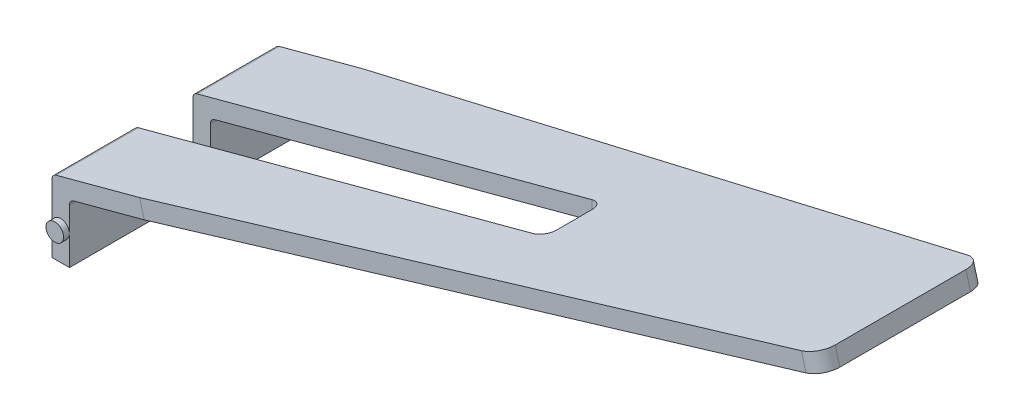
ISO-10303-21;
HEADER;
FILE_DESCRIPTION(('STEP AP214'),'2;1');
FILE_NAME('part.step','',(''),(''),'','','');
FILE_SCHEMA(('AUTOMOTIVE_DESIGN { 1 0 10303 214 1 1 1 1 }'));
ENDSEC;
DATA;
#1=APPLICATION_CONTEXT('core data for automotive mechanical design processes');
#2=APPLICATION_PROTOCOL_DEFINITION('international standard','automotive_design',2000,#1);
#3=PRODUCT_CONTEXT('',#1,'mechanical');
#4=PRODUCT('Part','Part','',(#3));
#5=PRODUCT_RELATED_PRODUCT_CATEGORY('part','',(#4));
#6=PRODUCT_DEFINITION_FORMATION('','',#4);
#7=PRODUCT_DEFINITION_CONTEXT('part definition',#1,'design');
#8=PRODUCT_DEFINITION('design','',#6,#7);
#9=PRODUCT_DEFINITION_SHAPE('','',#8);
#10=(LENGTH_UNIT() NAMED_UNIT(*) SI_UNIT(.MILLI.,.METRE.));
#11=(NAMED_UNIT(*) PLANE_ANGLE_UNIT() SI_UNIT($,.RADIAN.));
#12=(NAMED_UNIT(*) SI_UNIT($,.STERADIAN.) SOLID_ANGLE_UNIT());
#13=UNCERTAINTY_MEASURE_WITH_UNIT(LENGTH_MEASURE(1.E-05),#10,'distance_accuracy_value','');
#14=(GEOMETRIC_REPRESENTATION_CONTEXT(3) GLOBAL_UNCERTAINTY_ASSIGNED_CONTEXT((#13)) GLOBAL_UNIT_ASSIGNED_CONTEXT((#10,
#11,#12)) REPRESENTATION_CONTEXT('',''));
#15=CARTESIAN_POINT('',(0.,0.,0.));
#16=DIRECTION('',(0.,0.,1.));
#17=DIRECTION('',(1.,0.,0.));
#18=AXIS2_PLACEMENT_3D('',#15,#16,#17);
#19=CARTESIAN_POINT('',(0.3,0.,3.8));
#20=DIRECTION('',(0.,1.,0.));
#21=DIRECTION('',(0.,0.,1.));
#22=AXIS2_PLACEMENT_3D('',#19,#20,#21);
#23=PLANE('',#22);
#24=DIRECTION('',(0.,0.,-1.));
#25=VECTOR('',#24,1.);
#26=CARTESIAN_POINT('',(0.,0.,3.8));
#27=LINE('',#26,#25);
#28=CARTESIAN_POINT('',(0.,0.,3.8));
#29=VERTEX_POINT('',#28);
#30=CARTESIAN_POINT('',(0.,0.,2.40000000000001));
#31=VERTEX_POINT('',#30);
#32=EDGE_CURVE('E231',#29,#31,#27,.T.);
#33=ORIENTED_EDGE('',*,*,#32,.T.);
#34=DIRECTION('',(-1.,0.,0.));
#35=VECTOR('',#34,1.);
#36=CARTESIAN_POINT('',(0.,0.,2.40000000000001));
#37=LINE('',#36,#35);
#38=CARTESIAN_POINT('',(0.3,0.,2.40000000000001));
#39=VERTEX_POINT('',#38);
#40=EDGE_CURVE('E225',#39,#31,#37,.T.);
#41=ORIENTED_EDGE('',*,*,#40,.F.);
#42=DIRECTION('',(0.,0.,-1.));
#43=VECTOR('',#42,1.);
#44=CARTESIAN_POINT('',(0.3,0.,3.8));
#45=LINE('',#44,#43);
#46=CARTESIAN_POINT('',(0.3,0.,3.8));
#47=VERTEX_POINT('',#46);
#48=EDGE_CURVE('E247',#47,#39,#45,.T.);
#49=ORIENTED_EDGE('',*,*,#48,.F.);
#50=DIRECTION('',(1.,0.,0.));
#51=VECTOR('',#50,1.);
#52=CARTESIAN_POINT('',(0.3,0.,3.8));
#53=LINE('',#52,#51);
#54=EDGE_CURVE('E380',#29,#47,#53,.T.);
#55=ORIENTED_EDGE('',*,*,#54,.F.);
#56=EDGE_LOOP('',(#33,#41,#49,#55));
#57=FACE_BOUND('',#56,.T.);
#58=ADVANCED_FACE('F45',(#57),#23,.F.);
#59=CARTESIAN_POINT('',(0.3,1.,3.8));
#60=DIRECTION('',(-1.,0.,0.));
#61=DIRECTION('',(0.,-1.,0.));
#62=AXIS2_PLACEMENT_3D('',#59,#60,#61);
#63=PLANE('',#62);
#64=DIRECTION('',(0.,1.,0.));
#65=VECTOR('',#64,1.);
#66=CARTESIAN_POINT('',(0.3,1.,2.40000000000001));
#67=LINE('',#66,#65);
#68=CARTESIAN_POINT('',(0.3,0.923267301202103,2.40000000000001));
#69=VERTEX_POINT('',#68);
#70=EDGE_CURVE('E365',#39,#69,#67,.T.);
#71=ORIENTED_EDGE('',*,*,#70,.T.);
#72=DIRECTION('',(0.,0.,-1.));
#73=VECTOR('',#72,1.);
#74=CARTESIAN_POINT('',(0.3,0.923267301202103,3.8));
#75=LINE('',#74,#73);
#76=CARTESIAN_POINT('',(0.3,0.923267301202103,3.8));
#77=VERTEX_POINT('',#76);
#78=EDGE_CURVE('E298',#69,#77,#75,.F.);
#79=ORIENTED_EDGE('',*,*,#78,.T.);
#80=DIRECTION('',(0.,1.,0.));
#81=VECTOR('',#80,1.);
#82=CARTESIAN_POINT('',(0.3,1.,3.8));
#83=LINE('',#82,#81);
#84=CARTESIAN_POINT('',(0.3,0.5,3.8));
#85=VERTEX_POINT('',#84);
#86=EDGE_CURVE('E383',#85,#77,#83,.T.);
#87=ORIENTED_EDGE('',*,*,#86,.F.);
#88=EDGE_CURVE('E384',#47,#85,#83,.T.);
#89=ORIENTED_EDGE('',*,*,#88,.F.);
#90=ORIENTED_EDGE('',*,*,#48,.T.);
#91=EDGE_LOOP('',(#71,#79,#87,#89,#90));
#92=FACE_BOUND('',#91,.T.);
#93=ADVANCED_FACE('F435',(#92),#63,.F.);
#94=CARTESIAN_POINT('',(0.,0.,3.8));
#95=DIRECTION('',(1.,0.,0.));
#96=DIRECTION('',(0.,0.,-1.));
#97=AXIS2_PLACEMENT_3D('',#94,#95,#96);
#98=PLANE('',#97);
#99=DIRECTION('',(0.,-1.,0.));
#100=VECTOR('',#99,1.);
#101=CARTESIAN_POINT('',(0.,0.,3.8));
#102=LINE('',#101,#100);
#103=CARTESIAN_POINT('',(0.,1.15346539759579,3.8));
#104=VERTEX_POINT('',#103);
#105=CARTESIAN_POINT('',(0.,0.5,3.8));
#106=VERTEX_POINT('',#105);
#107=EDGE_CURVE('E232',#104,#106,#102,.T.);
#108=ORIENTED_EDGE('',*,*,#107,.F.);
#109=DIRECTION('',(0.,0.,-1.));
#110=VECTOR('',#109,1.);
#111=CARTESIAN_POINT('',(0.,1.15346539759579,3.8));
#112=LINE('',#111,#110);
#113=CARTESIAN_POINT('',(0.,1.15346539759579,2.40000000000001));
#114=VERTEX_POINT('',#113);
#115=EDGE_CURVE('E282',#104,#114,#112,.T.);
#116=ORIENTED_EDGE('',*,*,#115,.T.);
#117=DIRECTION('',(0.,-1.,0.));
#118=VECTOR('',#117,1.);
#119=CARTESIAN_POINT('',(0.,0.,2.40000000000001));
#120=LINE('',#119,#118);
#121=EDGE_CURVE('E216',#114,#31,#120,.T.);
#122=ORIENTED_EDGE('',*,*,#121,.T.);
#123=ORIENTED_EDGE('',*,*,#32,.F.);
#124=EDGE_CURVE('E236',#106,#29,#102,.T.);
#125=ORIENTED_EDGE('',*,*,#124,.F.);
#126=EDGE_LOOP('',(#108,#116,#122,#123,#125));
#127=FACE_BOUND('',#126,.T.);
#128=ADVANCED_FACE('F443',(#127),#98,.F.);
#129=CARTESIAN_POINT('',(0.,0.,3.8));
#130=DIRECTION('',(0.,0.,-1.));
#131=DIRECTION('',(-1.,0.,0.));
#132=AXIS2_PLACEMENT_3D('',#129,#130,#131);
#133=PLANE('',#132);
#134=DIRECTION('',(-0.965925826289069,-0.258819045102518,0.));
#135=VECTOR('',#134,1.);
#136=CARTESIAN_POINT('',(0.,1.23019809639369,3.8));
#137=LINE('',#136,#135);
#138=CARTESIAN_POINT('',(1.49536641050825,1.630880318478,3.8));
#139=VERTEX_POINT('',#138);
#140=CARTESIAN_POINT('',(0.0741180954897482,1.2500579802247,3.8));
#141=VERTEX_POINT('',#140);
#142=EDGE_CURVE('E390',#139,#141,#137,.T.);
#143=ORIENTED_EDGE('',*,*,#142,.T.);
#144=CARTESIAN_POINT('',(0.1,1.15346539759579,3.8));
#145=DIRECTION('',(0.,0.,-1.));
#146=DIRECTION('',(-1.,0.,0.));
#147=AXIS2_PLACEMENT_3D('',#144,#145,#146);
#148=CIRCLE('',#147,0.1);
#149=EDGE_CURVE('E288',#141,#104,#148,.F.);
#150=ORIENTED_EDGE('',*,*,#149,.T.);
#151=ORIENTED_EDGE('',*,*,#107,.T.);
#152=CARTESIAN_POINT('',(0.15,0.5,3.8));
#153=DIRECTION('',(0.,0.,-1.));
#154=DIRECTION('',(-1.,0.,0.));
#155=AXIS2_PLACEMENT_3D('',#152,#153,#154);
#156=CIRCLE('',#155,0.15);
#157=EDGE_CURVE('E379',#106,#85,#156,.T.);
#158=ORIENTED_EDGE('',*,*,#157,.T.);
#159=ORIENTED_EDGE('',*,*,#86,.T.);
#160=CARTESIAN_POINT('',(0.399999999999999,0.923267301202103,3.8));
#161=DIRECTION('',(0.,0.,-1.));
#162=DIRECTION('',(-1.,0.,0.));
#163=AXIS2_PLACEMENT_3D('',#160,#161,#162);
#164=CIRCLE('',#163,0.1);
#165=CARTESIAN_POINT('',(0.374118095489749,1.01985988383101,3.8));
#166=VERTEX_POINT('',#165);
#167=EDGE_CURVE('E307',#77,#166,#164,.T.);
#168=ORIENTED_EDGE('',*,*,#167,.T.);
#169=DIRECTION('',(0.965925826289069,0.258819045102518,0.));
#170=VECTOR('',#169,1.);
#171=CARTESIAN_POINT('',(12.6346814552887,4.3050679348397,3.8));
#172=LINE('',#171,#170);
#173=CARTESIAN_POINT('',(1.57301212403901,1.34110257059128,3.8));
#174=VERTEX_POINT('',#173);
#175=EDGE_CURVE('E387',#166,#174,#172,.T.);
#176=ORIENTED_EDGE('',*,*,#175,.T.);
#177=DIRECTION('',(-0.258819045102518,0.965925826289069,0.));
#178=VECTOR('',#177,1.);
#179=CARTESIAN_POINT('',(1.80291593460667,0.483089868699056,3.8));
#180=LINE('',#179,#178);
#181=EDGE_CURVE('E250',#174,#139,#180,.T.);
#182=ORIENTED_EDGE('',*,*,#181,.T.);
#183=EDGE_LOOP('',(#143,#150,#151,#158,#159,#168,#176,#182));
#184=FACE_BOUND('',#183,.T.);
#185=ADVANCED_FACE('F453',(#184),#133,.F.);
#186=CARTESIAN_POINT('',(0.,0.,0.));
#187=DIRECTION('',(0.,0.,-1.));
#188=DIRECTION('',(-1.,0.,0.));
#189=AXIS2_PLACEMENT_3D('',#186,#187,#188);
#190=PLANE('',#189);
#191=DIRECTION('',(0.,-1.,0.));
#192=VECTOR('',#191,1.);
#193=CARTESIAN_POINT('',(0.,0.,0.));
#194=LINE('',#193,#192);
#195=CARTESIAN_POINT('',(0.,1.15346539759579,0.));
#196=VERTEX_POINT('',#195);
#197=CARTESIAN_POINT('',(0.,0.5,0.));
#198=VERTEX_POINT('',#197);
#199=EDGE_CURVE('E240',#196,#198,#194,.T.);
#200=ORIENTED_EDGE('',*,*,#199,.F.);
#201=CARTESIAN_POINT('',(0.1,1.15346539759579,0.));
#202=DIRECTION('',(0.,0.,-1.));
#203=DIRECTION('',(-1.,0.,0.));
#204=AXIS2_PLACEMENT_3D('',#201,#202,#203);
#205=CIRCLE('',#204,0.1);
#206=CARTESIAN_POINT('',(0.0741180954897482,1.2500579802247,0.));
#207=VERTEX_POINT('',#206);
#208=EDGE_CURVE('E275',#196,#207,#205,.T.);
#209=ORIENTED_EDGE('',*,*,#208,.T.);
#210=DIRECTION('',(-0.965925826289069,-0.258819045102518,0.));
#211=VECTOR('',#210,1.);
#212=CARTESIAN_POINT('',(0.,1.23019809639369,0.));
#213=LINE('',#212,#211);
#214=CARTESIAN_POINT('',(1.49536641050825,1.630880318478,0.));
#215=VERTEX_POINT('',#214);
#216=EDGE_CURVE('E400',#215,#207,#213,.T.);
#217=ORIENTED_EDGE('',*,*,#216,.F.);
#218=DIRECTION('',(0.258819045102518,-0.965925826289069,0.));
#219=VECTOR('',#218,1.);
#220=CARTESIAN_POINT('',(1.57301212403901,1.34110257059127,0.));
#221=LINE('',#220,#219);
#222=CARTESIAN_POINT('',(1.57301212403901,1.34110257059128,0.));
#223=VERTEX_POINT('',#222);
#224=EDGE_CURVE('E263',#215,#223,#221,.T.);
#225=ORIENTED_EDGE('',*,*,#224,.T.);
#226=DIRECTION('',(0.965925826289069,0.258819045102518,0.));
#227=VECTOR('',#226,1.);
#228=CARTESIAN_POINT('',(12.6346814552887,4.3050679348397,0.));
#229=LINE('',#228,#227);
#230=CARTESIAN_POINT('',(0.374118095489749,1.01985988383101,0.));
#231=VERTEX_POINT('',#230);
#232=EDGE_CURVE('E399',#231,#223,#229,.T.);
#233=ORIENTED_EDGE('',*,*,#232,.F.);
#234=CARTESIAN_POINT('',(0.399999999999999,0.923267301202103,0.));
#235=DIRECTION('',(0.,0.,-1.));
#236=DIRECTION('',(-1.,0.,0.));
#237=AXIS2_PLACEMENT_3D('',#234,#235,#236);
#238=CIRCLE('',#237,0.1);
#239=CARTESIAN_POINT('',(0.3,0.923267301202103,0.));
#240=VERTEX_POINT('',#239);
#241=EDGE_CURVE('E300',#231,#240,#238,.F.);
#242=ORIENTED_EDGE('',*,*,#241,.T.);
#243=DIRECTION('',(0.,1.,0.));
#244=VECTOR('',#243,1.);
#245=CARTESIAN_POINT('',(0.3,1.,0.));
#246=LINE('',#245,#244);
#247=CARTESIAN_POINT('',(0.3,0.5,0.));
#248=VERTEX_POINT('',#247);
#249=EDGE_CURVE('E395',#248,#240,#246,.T.);
#250=ORIENTED_EDGE('',*,*,#249,.F.);
#251=CARTESIAN_POINT('',(0.15,0.5,0.));
#252=DIRECTION('',(0.,0.,-1.));
#253=DIRECTION('',(-1.,0.,0.));
#254=AXIS2_PLACEMENT_3D('',#251,#252,#253);
#255=CIRCLE('',#254,0.15);
#256=EDGE_CURVE('E217',#198,#248,#255,.T.);
#257=ORIENTED_EDGE('',*,*,#256,.F.);
#258=EDGE_LOOP('',(#200,#209,#217,#225,#233,#242,#250,#257));
#259=FACE_BOUND('',#258,.T.);
#260=ADVANCED_FACE('F412',(#259),#190,.T.);
#261=CARTESIAN_POINT('',(0.3,0.,1.4));
#262=VERTEX_POINT('',#261);
#263=CARTESIAN_POINT('',(0.3,0.,0.));
#264=VERTEX_POINT('',#263);
#265=EDGE_CURVE('E224',#262,#264,#45,.T.);
#266=ORIENTED_EDGE('',*,*,#265,.F.);
#267=DIRECTION('',(1.,0.,0.));
#268=VECTOR('',#267,1.);
#269=CARTESIAN_POINT('',(0.,0.,1.4));
#270=LINE('',#269,#268);
#271=CARTESIAN_POINT('',(0.,0.,1.4));
#272=VERTEX_POINT('',#271);
#273=EDGE_CURVE('E208',#272,#262,#270,.T.);
#274=ORIENTED_EDGE('',*,*,#273,.F.);
#275=CARTESIAN_POINT('',(0.,0.,0.));
#276=VERTEX_POINT('',#275);
#277=EDGE_CURVE('E222',#272,#276,#27,.T.);
#278=ORIENTED_EDGE('',*,*,#277,.T.);
#279=DIRECTION('',(1.,0.,0.));
#280=VECTOR('',#279,1.);
#281=CARTESIAN_POINT('',(0.3,0.,0.));
#282=LINE('',#281,#280);
#283=EDGE_CURVE('E393',#276,#264,#282,.T.);
#284=ORIENTED_EDGE('',*,*,#283,.T.);
#285=EDGE_LOOP('',(#266,#274,#278,#284));
#286=FACE_BOUND('',#285,.T.);
#287=ADVANCED_FACE('F220',(#286),#23,.F.);
#288=ORIENTED_EDGE('',*,*,#249,.T.);
#289=DIRECTION('',(0.,0.,-1.));
#290=VECTOR('',#289,1.);
#291=CARTESIAN_POINT('',(0.3,0.923267301202103,1.4));
#292=LINE('',#291,#290);
#293=CARTESIAN_POINT('',(0.3,0.923267301202103,1.4));
#294=VERTEX_POINT('',#293);
#295=EDGE_CURVE('E296',#240,#294,#292,.F.);
#296=ORIENTED_EDGE('',*,*,#295,.T.);
#297=DIRECTION('',(0.,-1.,0.));
#298=VECTOR('',#297,1.);
#299=CARTESIAN_POINT('',(0.3,1.,1.4));
#300=LINE('',#299,#298);
#301=EDGE_CURVE('E355',#294,#262,#300,.T.);
#302=ORIENTED_EDGE('',*,*,#301,.T.);
#303=ORIENTED_EDGE('',*,*,#265,.T.);
#304=EDGE_CURVE('E396',#264,#248,#246,.T.);
#305=ORIENTED_EDGE('',*,*,#304,.T.);
#306=EDGE_LOOP('',(#288,#296,#302,#303,#305));
#307=FACE_BOUND('',#306,.T.);
#308=ADVANCED_FACE('F446',(#307),#63,.F.);
#309=CARTESIAN_POINT('',(12.6346814552887,4.3050679348397,3.8));
#310=DIRECTION('',(-0.258819045102518,0.965925826289069,0.));
#311=DIRECTION('',(-0.965925826289069,-0.258819045102518,0.));
#312=AXIS2_PLACEMENT_3D('',#309,#310,#311);
#313=PLANE('',#312);
#314=DIRECTION('',(0.965006478934081,0.258572706721185,0.0436193873653364));
#315=VECTOR('',#314,1.);
#316=CARTESIAN_POINT('',(12.6346814552887,4.3050679348397,0.5));
#317=LINE('',#316,#315);
#318=CARTESIAN_POINT('',(12.3575436352369,4.2308090797647,0.487473056201885));
#319=VERTEX_POINT('',#318);
#320=EDGE_CURVE('E258',#223,#319,#317,.T.);
#321=ORIENTED_EDGE('',*,*,#320,.T.);
#322=CARTESIAN_POINT('',(12.3449037074019,4.22742222130895,0.787187522676442));
#323=DIRECTION('',(-0.258819045102518,0.965925826289069,0.));
#324=DIRECTION('',(-0.965925826289069,-0.258819045102518,0.));
#325=AXIS2_PLACEMENT_3D('',#322,#323,#324);
#326=CIRCLE('',#325,0.3);
#327=CARTESIAN_POINT('',(12.6346814552887,4.3050679348397,0.787187522676443));
#328=VERTEX_POINT('',#327);
#329=EDGE_CURVE('E323',#319,#328,#326,.F.);
#330=ORIENTED_EDGE('',*,*,#329,.T.);
#331=DIRECTION('',(0.,0.,-1.));
#332=VECTOR('',#331,1.);
#333=CARTESIAN_POINT('',(12.6346814552887,4.3050679348397,3.8));
#334=LINE('',#333,#332);
#335=CARTESIAN_POINT('',(12.6346814552887,4.3050679348397,3.01281247732356));
#336=VERTEX_POINT('',#335);
#337=EDGE_CURVE('E244',#336,#328,#334,.T.);
#338=ORIENTED_EDGE('',*,*,#337,.F.);
#339=CARTESIAN_POINT('',(12.3449037074019,4.22742222130895,3.01281247732356));
#340=DIRECTION('',(-0.258819045102518,0.965925826289069,0.));
#341=DIRECTION('',(-0.965925826289069,-0.258819045102518,0.));
#342=AXIS2_PLACEMENT_3D('',#339,#340,#341);
#343=CIRCLE('',#342,0.3);
#344=CARTESIAN_POINT('',(12.3575436352369,4.2308090797647,3.31252694379812));
#345=VERTEX_POINT('',#344);
#346=EDGE_CURVE('E321',#336,#345,#343,.F.);
#347=ORIENTED_EDGE('',*,*,#346,.T.);
#348=DIRECTION('',(0.965006478934081,0.258572706721185,-0.0436193873653364));
#349=VECTOR('',#348,1.);
#350=CARTESIAN_POINT('',(1.57301212403901,1.34110257059128,3.8));
#351=LINE('',#350,#349);
#352=EDGE_CURVE('E261',#345,#174,#351,.F.);
#353=ORIENTED_EDGE('',*,*,#352,.T.);
#354=ORIENTED_EDGE('',*,*,#175,.F.);
#355=DIRECTION('',(0.,0.,-1.));
#356=VECTOR('',#355,1.);
#357=CARTESIAN_POINT('',(0.374118095489747,1.01985988383101,2.40000000000001));
#358=LINE('',#357,#356);
#359=CARTESIAN_POINT('',(0.374118095489746,1.01985988383101,2.40000000000001));
#360=VERTEX_POINT('',#359);
#361=EDGE_CURVE('E290',#166,#360,#358,.T.);
#362=ORIENTED_EDGE('',*,*,#361,.T.);
#363=DIRECTION('',(0.965925826289069,0.258819045102518,0.));
#364=VECTOR('',#363,1.);
#365=CARTESIAN_POINT('',(12.6346814552887,4.3050679348397,2.40000000000001));
#366=LINE('',#365,#364);
#367=CARTESIAN_POINT('',(6.8,2.74166975080228,2.40000000000001));
#368=VERTEX_POINT('',#367);
#369=EDGE_CURVE('E354',#360,#368,#366,.T.);
#370=ORIENTED_EDGE('',*,*,#369,.T.);
#371=CARTESIAN_POINT('',(6.8,2.74166975080228,2.20000000000001));
#372=DIRECTION('',(-0.258819045102518,0.965925826289069,0.));
#373=DIRECTION('',(0.965925826289069,0.258819045102518,0.));
#374=AXIS2_PLACEMENT_3D('',#371,#372,#373);
#375=ELLIPSE('',#374,0.207055236082016,0.2);
#376=CARTESIAN_POINT('',(7.,2.7952595892885,2.20000000000001));
#377=VERTEX_POINT('',#376);
#378=EDGE_CURVE('E336',#368,#377,#375,.T.);
#379=ORIENTED_EDGE('',*,*,#378,.T.);
#380=DIRECTION('',(0.,0.,-1.));
#381=VECTOR('',#380,1.);
#382=CARTESIAN_POINT('',(7.,2.7952595892885,3.79999999999999));
#383=LINE('',#382,#381);
#384=CARTESIAN_POINT('',(7.,2.7952595892885,1.60000000000001));
#385=VERTEX_POINT('',#384);
#386=EDGE_CURVE('E360',#377,#385,#383,.T.);
#387=ORIENTED_EDGE('',*,*,#386,.T.);
#388=CARTESIAN_POINT('',(6.8,2.74166975080228,1.60000000000001));
#389=DIRECTION('',(-0.258819045102518,0.965925826289069,0.));
#390=DIRECTION('',(0.965925826289069,0.258819045102518,0.));
#391=AXIS2_PLACEMENT_3D('',#388,#389,#390);
#392=ELLIPSE('',#391,0.207055236082016,0.2);
#393=CARTESIAN_POINT('',(6.8,2.74166975080228,1.40000000000001));
#394=VERTEX_POINT('',#393);
#395=EDGE_CURVE('E53',#385,#394,#392,.T.);
#396=ORIENTED_EDGE('',*,*,#395,.T.);
#397=DIRECTION('',(-0.965925826289069,-0.258819045102518,0.));
#398=VECTOR('',#397,1.);
#399=CARTESIAN_POINT('',(12.6346814552887,4.3050679348397,1.40000000000002));
#400=LINE('',#399,#398);
#401=CARTESIAN_POINT('',(0.374118095489746,1.01985988383101,1.4));
#402=VERTEX_POINT('',#401);
#403=EDGE_CURVE('E486',#394,#402,#400,.T.);
#404=ORIENTED_EDGE('',*,*,#403,.T.);
#405=DIRECTION('',(0.,0.,-1.));
#406=VECTOR('',#405,1.);
#407=CARTESIAN_POINT('',(0.374118095489747,1.01985988383101,0.));
#408=LINE('',#407,#406);
#409=EDGE_CURVE('E293',#402,#231,#408,.T.);
#410=ORIENTED_EDGE('',*,*,#409,.T.);
#411=ORIENTED_EDGE('',*,*,#232,.T.);
#412=EDGE_LOOP('',(#321,#330,#338,#347,#353,#354,#362,#370,#379,#387,#396,#404,#410,#411));
#413=FACE_BOUND('',#412,.T.);
#414=ADVANCED_FACE('F359',(#413),#313,.F.);
#415=CARTESIAN_POINT('',(12.5570357417579,4.59484568272643,3.8));
#416=DIRECTION('',(-0.965925826289069,-0.258819045102518,0.));
#417=DIRECTION('',(0.258819045102518,-0.965925826289069,0.));
#418=AXIS2_PLACEMENT_3D('',#415,#416,#417);
#419=PLANE('',#418);
#420=ORIENTED_EDGE('',*,*,#337,.T.);
#421=DIRECTION('',(-0.258819045102518,0.965925826289069,0.));
#422=VECTOR('',#421,1.);
#423=CARTESIAN_POINT('',(12.5570357417579,4.59484568272643,0.787187522676442));
#424=LINE('',#423,#422);
#425=CARTESIAN_POINT('',(12.5570357417579,4.59484568272643,0.787187522676443));
#426=VERTEX_POINT('',#425);
#427=EDGE_CURVE('E312',#328,#426,#424,.T.);
#428=ORIENTED_EDGE('',*,*,#427,.T.);
#429=DIRECTION('',(0.,0.,-1.));
#430=VECTOR('',#429,1.);
#431=CARTESIAN_POINT('',(12.5570357417579,4.59484568272643,3.8));
#432=LINE('',#431,#430);
#433=CARTESIAN_POINT('',(12.5570357417579,4.59484568272643,3.01281247732356));
#434=VERTEX_POINT('',#433);
#435=EDGE_CURVE('E235',#434,#426,#432,.T.);
#436=ORIENTED_EDGE('',*,*,#435,.F.);
#437=DIRECTION('',(-0.258819045102518,0.965925826289069,0.));
#438=VECTOR('',#437,1.);
#439=CARTESIAN_POINT('',(12.6346814552887,4.3050679348397,3.01281247732356));
#440=LINE('',#439,#438);
#441=EDGE_CURVE('E309',#434,#336,#440,.F.);
#442=ORIENTED_EDGE('',*,*,#441,.T.);
#443=EDGE_LOOP('',(#420,#428,#436,#442));
#444=FACE_BOUND('',#443,.T.);
#445=ADVANCED_FACE('F510',(#444),#419,.F.);
#446=CARTESIAN_POINT('',(0.,1.23019809639369,3.8));
#447=DIRECTION('',(0.258819045102518,-0.965925826289069,0.));
#448=DIRECTION('',(0.965925826289069,0.258819045102518,0.));
#449=AXIS2_PLACEMENT_3D('',#446,#447,#448);
#450=PLANE('',#449);
#451=ORIENTED_EDGE('',*,*,#435,.T.);
#452=CARTESIAN_POINT('',(12.2672579938712,4.51719996919567,0.787187522676442));
#453=DIRECTION('',(0.258819045102518,-0.965925826289069,0.));
#454=DIRECTION('',(0.965925826289069,0.258819045102518,0.));
#455=AXIS2_PLACEMENT_3D('',#452,#453,#454);
#456=CIRCLE('',#455,0.3);
#457=CARTESIAN_POINT('',(12.2798979217061,4.52058682765143,0.487473056201885));
#458=VERTEX_POINT('',#457);
#459=EDGE_CURVE('E317',#426,#458,#456,.F.);
#460=ORIENTED_EDGE('',*,*,#459,.T.);
#461=DIRECTION('',(-0.965006478934081,-0.258572706721186,-0.0436193873653365));
#462=VECTOR('',#461,1.);
#463=CARTESIAN_POINT('',(12.5570357417579,4.59484568272643,0.5));
#464=LINE('',#463,#462);
#465=EDGE_CURVE('E253',#458,#215,#464,.T.);
#466=ORIENTED_EDGE('',*,*,#465,.T.);
#467=ORIENTED_EDGE('',*,*,#216,.T.);
#468=DIRECTION('',(0.,0.,-1.));
#469=VECTOR('',#468,1.);
#470=CARTESIAN_POINT('',(0.0741180954897482,1.2500579802247,3.8));
#471=LINE('',#470,#469);
#472=CARTESIAN_POINT('',(0.0741180954897481,1.2500579802247,1.4));
#473=VERTEX_POINT('',#472);
#474=EDGE_CURVE('E279',#207,#473,#471,.F.);
#475=ORIENTED_EDGE('',*,*,#474,.T.);
#476=DIRECTION('',(0.965925826289069,0.258819045102518,0.));
#477=VECTOR('',#476,1.);
#478=CARTESIAN_POINT('',(0.,1.23019809639369,1.4));
#479=LINE('',#478,#477);
#480=CARTESIAN_POINT('',(6.8,3.05225260492531,1.40000000000001));
#481=VERTEX_POINT('',#480);
#482=EDGE_CURVE('E488',#473,#481,#479,.T.);
#483=ORIENTED_EDGE('',*,*,#482,.T.);
#484=CARTESIAN_POINT('',(6.8,3.0522526049253,1.60000000000001));
#485=DIRECTION('',(0.258819045102518,-0.965925826289069,0.));
#486=DIRECTION('',(0.965925826289069,0.258819045102518,0.));
#487=AXIS2_PLACEMENT_3D('',#484,#485,#486);
#488=ELLIPSE('',#487,0.207055236082016,0.2);
#489=CARTESIAN_POINT('',(7.,3.10584244341153,1.60000000000001));
#490=VERTEX_POINT('',#489);
#491=EDGE_CURVE('E11',#481,#490,#488,.T.);
#492=ORIENTED_EDGE('',*,*,#491,.T.);
#493=DIRECTION('',(0.,0.,1.));
#494=VECTOR('',#493,1.);
#495=CARTESIAN_POINT('',(7.,3.10584244341153,3.80000000000001));
#496=LINE('',#495,#494);
#497=CARTESIAN_POINT('',(7.,3.10584244341153,2.20000000000001));
#498=VERTEX_POINT('',#497);
#499=EDGE_CURVE('E270',#490,#498,#496,.T.);
#500=ORIENTED_EDGE('',*,*,#499,.T.);
#501=CARTESIAN_POINT('',(6.8,3.0522526049253,2.20000000000001));
#502=DIRECTION('',(0.258819045102518,-0.965925826289069,0.));
#503=DIRECTION('',(0.965925826289069,0.258819045102518,0.));
#504=AXIS2_PLACEMENT_3D('',#501,#502,#503);
#505=ELLIPSE('',#504,0.207055236082016,0.2);
#506=CARTESIAN_POINT('',(6.8,3.05225260492531,2.40000000000001));
#507=VERTEX_POINT('',#506);
#508=EDGE_CURVE('E338',#498,#507,#505,.T.);
#509=ORIENTED_EDGE('',*,*,#508,.T.);
#510=DIRECTION('',(-0.965925826289069,-0.258819045102518,0.));
#511=VECTOR('',#510,1.);
#512=CARTESIAN_POINT('',(0.,1.23019809639369,2.40000000000001));
#513=LINE('',#512,#511);
#514=CARTESIAN_POINT('',(0.0741180954897482,1.2500579802247,2.40000000000001));
#515=VERTEX_POINT('',#514);
#516=EDGE_CURVE('E343',#507,#515,#513,.T.);
#517=ORIENTED_EDGE('',*,*,#516,.T.);
#518=DIRECTION('',(0.,0.,-1.));
#519=VECTOR('',#518,1.);
#520=CARTESIAN_POINT('',(0.0741180954897482,1.2500579802247,3.8));
#521=LINE('',#520,#519);
#522=EDGE_CURVE('E277',#515,#141,#521,.F.);
#523=ORIENTED_EDGE('',*,*,#522,.T.);
#524=ORIENTED_EDGE('',*,*,#142,.F.);
#525=DIRECTION('',(-0.965006478934081,-0.258572706721186,0.0436193873653365));
#526=VECTOR('',#525,1.);
#527=CARTESIAN_POINT('',(1.49536641050825,1.630880318478,3.8));
#528=LINE('',#527,#526);
#529=CARTESIAN_POINT('',(12.2798979217061,4.52058682765143,3.31252694379812));
#530=VERTEX_POINT('',#529);
#531=EDGE_CURVE('E255',#139,#530,#528,.F.);
#532=ORIENTED_EDGE('',*,*,#531,.T.);
#533=CARTESIAN_POINT('',(12.2672579938712,4.51719996919567,3.01281247732356));
#534=DIRECTION('',(0.258819045102518,-0.965925826289069,0.));
#535=DIRECTION('',(0.965925826289069,0.258819045102518,0.));
#536=AXIS2_PLACEMENT_3D('',#533,#534,#535);
#537=CIRCLE('',#536,0.3);
#538=EDGE_CURVE('E315',#530,#434,#537,.F.);
#539=ORIENTED_EDGE('',*,*,#538,.T.);
#540=EDGE_LOOP('',(#451,#460,#466,#467,#475,#483,#492,#500,#509,#517,#523,#524,#532,#539));
#541=FACE_BOUND('',#540,.T.);
#542=ADVANCED_FACE('F342',(#541),#450,.F.);
#543=DIRECTION('',(0.,1.,0.));
#544=VECTOR('',#543,1.);
#545=CARTESIAN_POINT('',(0.,0.,1.4));
#546=LINE('',#545,#544);
#547=CARTESIAN_POINT('',(0.,1.15346539759579,1.4));
#548=VERTEX_POINT('',#547);
#549=EDGE_CURVE('E204',#272,#548,#546,.T.);
#550=ORIENTED_EDGE('',*,*,#549,.T.);
#551=DIRECTION('',(0.,0.,-1.));
#552=VECTOR('',#551,1.);
#553=CARTESIAN_POINT('',(0.,1.15346539759579,3.8));
#554=LINE('',#553,#552);
#555=EDGE_CURVE('E273',#548,#196,#554,.T.);
#556=ORIENTED_EDGE('',*,*,#555,.T.);
#557=ORIENTED_EDGE('',*,*,#199,.T.);
#558=EDGE_CURVE('E229',#198,#276,#194,.T.);
#559=ORIENTED_EDGE('',*,*,#558,.T.);
#560=ORIENTED_EDGE('',*,*,#277,.F.);
#561=EDGE_LOOP('',(#550,#556,#557,#559,#560));
#562=FACE_BOUND('',#561,.T.);
#563=ADVANCED_FACE('F227',(#562),#98,.F.);
#564=ORIENTED_EDGE('',*,*,#88,.T.);
#565=EDGE_CURVE('E376',#85,#106,#156,.T.);
#566=ORIENTED_EDGE('',*,*,#565,.T.);
#567=ORIENTED_EDGE('',*,*,#124,.T.);
#568=ORIENTED_EDGE('',*,*,#54,.T.);
#569=EDGE_LOOP('',(#564,#566,#567,#568));
#570=FACE_BOUND('',#569,.T.);
#571=ADVANCED_FACE('F460',(#570),#133,.F.);
#572=EDGE_CURVE('E266',#248,#198,#255,.T.);
#573=ORIENTED_EDGE('',*,*,#572,.F.);
#574=ORIENTED_EDGE('',*,*,#304,.F.);
#575=ORIENTED_EDGE('',*,*,#283,.F.);
#576=ORIENTED_EDGE('',*,*,#558,.F.);
#577=EDGE_LOOP('',(#573,#574,#575,#576));
#578=FACE_BOUND('',#577,.T.);
#579=ADVANCED_FACE('F408',(#578),#190,.T.);
#580=CARTESIAN_POINT('',(1.80291593460667,0.483089868699056,3.8));
#581=DIRECTION('',(-0.0421330927830856,-0.0112895281858532,-0.999048221581858));
#582=DIRECTION('',(-0.258819045102518,0.965925826289069,0.));
#583=AXIS2_PLACEMENT_3D('',#580,#581,#582);
#584=PLANE('',#583);
#585=ORIENTED_EDGE('',*,*,#352,.F.);
#586=DIRECTION('',(0.258819045102518,-0.965925826289069,0.));
#587=VECTOR('',#586,1.);
#588=CARTESIAN_POINT('',(12.2798979217061,4.52058682765143,3.31252694379811));
#589=LINE('',#588,#587);
#590=EDGE_CURVE('E325',#345,#530,#589,.F.);
#591=ORIENTED_EDGE('',*,*,#590,.T.);
#592=ORIENTED_EDGE('',*,*,#531,.F.);
#593=ORIENTED_EDGE('',*,*,#181,.F.);
#594=EDGE_LOOP('',(#585,#591,#592,#593));
#595=FACE_BOUND('',#594,.T.);
#596=ADVANCED_FACE('F430',(#595),#584,.F.);
#597=CARTESIAN_POINT('',(12.5570357417579,4.59484568272643,0.5));
#598=DIRECTION('',(0.0421330927830856,0.0112895281858532,-0.999048221581858));
#599=DIRECTION('',(0.258819045102518,-0.965925826289069,0.));
#600=AXIS2_PLACEMENT_3D('',#597,#598,#599);
#601=PLANE('',#600);
#602=ORIENTED_EDGE('',*,*,#465,.F.);
#603=DIRECTION('',(-0.258819045102518,0.965925826289069,0.));
#604=VECTOR('',#603,1.);
#605=CARTESIAN_POINT('',(12.3575436352369,4.2308090797647,0.487473056201885));
#606=LINE('',#605,#604);
#607=EDGE_CURVE('E319',#458,#319,#606,.F.);
#608=ORIENTED_EDGE('',*,*,#607,.T.);
#609=ORIENTED_EDGE('',*,*,#320,.F.);
#610=ORIENTED_EDGE('',*,*,#224,.F.);
#611=EDGE_LOOP('',(#602,#608,#609,#610));
#612=FACE_BOUND('',#611,.T.);
#613=ADVANCED_FACE('F424',(#612),#601,.T.);
#614=CARTESIAN_POINT('',(0.15,0.5,-0.0999999999999998));
#615=DIRECTION('',(0.,0.,1.));
#616=DIRECTION('',(1.,0.,0.));
#617=AXIS2_PLACEMENT_3D('',#614,#615,#616);
#618=PLANE('',#617);
#619=CARTESIAN_POINT('',(0.15,0.5,-0.0999999999999998));
#620=DIRECTION('',(0.,0.,1.));
#621=DIRECTION('',(1.,0.,0.));
#622=AXIS2_PLACEMENT_3D('',#619,#620,#621);
#623=CIRCLE('',#622,0.15);
#624=CARTESIAN_POINT('',(0.3,0.5,-0.0999999999999998));
#625=VERTEX_POINT('',#624);
#626=EDGE_CURVE('E368',#625,#625,#623,.T.);
#627=ORIENTED_EDGE('',*,*,#626,.F.);
#628=EDGE_LOOP('',(#627));
#629=FACE_BOUND('',#628,.T.);
#630=ADVANCED_FACE('F419',(#629),#618,.F.);
#631=CARTESIAN_POINT('',(0.15,0.5,-0.0999999999999998));
#632=DIRECTION('',(0.,0.,1.));
#633=DIRECTION('',(1.,0.,0.));
#634=AXIS2_PLACEMENT_3D('',#631,#632,#633);
#635=CYLINDRICAL_SURFACE('',#634,0.15);
#636=ORIENTED_EDGE('',*,*,#572,.T.);
#637=ORIENTED_EDGE('',*,*,#256,.T.);
#638=EDGE_LOOP('',(#636,#637));
#639=FACE_BOUND('',#638,.T.);
#640=ORIENTED_EDGE('',*,*,#626,.T.);
#641=EDGE_LOOP('',(#640));
#642=FACE_BOUND('',#641,.T.);
#643=ADVANCED_FACE('F415',(#639,#642),#635,.T.);
#644=CARTESIAN_POINT('',(0.15,0.5,3.9));
#645=DIRECTION('',(0.,0.,1.));
#646=DIRECTION('',(1.,0.,0.));
#647=AXIS2_PLACEMENT_3D('',#644,#645,#646);
#648=CIRCLE('',#647,0.15);
#649=CARTESIAN_POINT('',(0.3,0.5,3.9));
#650=VERTEX_POINT('',#649);
#651=EDGE_CURVE('E364',#650,#650,#648,.T.);
#652=ORIENTED_EDGE('',*,*,#651,.F.);
#653=EDGE_LOOP('',(#652));
#654=FACE_BOUND('',#653,.T.);
#655=ORIENTED_EDGE('',*,*,#157,.F.);
#656=ORIENTED_EDGE('',*,*,#565,.F.);
#657=EDGE_LOOP('',(#655,#656));
#658=FACE_BOUND('',#657,.T.);
#659=ADVANCED_FACE('F418',(#654,#658),#635,.T.);
#660=CARTESIAN_POINT('',(0.15,0.5,3.9));
#661=DIRECTION('',(0.,0.,1.));
#662=DIRECTION('',(1.,0.,0.));
#663=AXIS2_PLACEMENT_3D('',#660,#661,#662);
#664=PLANE('',#663);
#665=ORIENTED_EDGE('',*,*,#651,.T.);
#666=EDGE_LOOP('',(#665));
#667=FACE_BOUND('',#666,.T.);
#668=ADVANCED_FACE('F553',(#667),#664,.T.);
#669=CARTESIAN_POINT('',(7.,10.,2.40000000000001));
#670=DIRECTION('',(1.,0.,0.));
#671=DIRECTION('',(0.,0.,-1.));
#672=AXIS2_PLACEMENT_3D('',#669,#670,#671);
#673=PLANE('',#672);
#674=ORIENTED_EDGE('',*,*,#386,.F.);
#675=DIRECTION('',(0.,-1.,0.));
#676=VECTOR('',#675,1.);
#677=CARTESIAN_POINT('',(7.,3.10584244341153,2.20000000000001));
#678=LINE('',#677,#676);
#679=EDGE_CURVE('E333',#377,#498,#678,.F.);
#680=ORIENTED_EDGE('',*,*,#679,.T.);
#681=ORIENTED_EDGE('',*,*,#499,.F.);
#682=DIRECTION('',(0.,-1.,0.));
#683=VECTOR('',#682,1.);
#684=CARTESIAN_POINT('',(7.,2.7952595892885,1.60000000000001));
#685=LINE('',#684,#683);
#686=EDGE_CURVE('E330',#490,#385,#685,.T.);
#687=ORIENTED_EDGE('',*,*,#686,.T.);
#688=EDGE_LOOP('',(#674,#680,#681,#687));
#689=FACE_BOUND('',#688,.T.);
#690=ADVANCED_FACE('F362',(#689),#673,.F.);
#691=CARTESIAN_POINT('',(0.,10.,2.40000000000001));
#692=DIRECTION('',(0.,0.,1.));
#693=DIRECTION('',(1.,0.,0.));
#694=AXIS2_PLACEMENT_3D('',#691,#692,#693);
#695=PLANE('',#694);
#696=ORIENTED_EDGE('',*,*,#516,.F.);
#697=DIRECTION('',(0.,-1.,0.));
#698=VECTOR('',#697,1.);
#699=CARTESIAN_POINT('',(6.8,2.7952595892885,2.40000000000001));
#700=LINE('',#699,#698);
#701=EDGE_CURVE('E327',#507,#368,#700,.T.);
#702=ORIENTED_EDGE('',*,*,#701,.T.);
#703=ORIENTED_EDGE('',*,*,#369,.F.);
#704=CARTESIAN_POINT('',(0.399999999999999,0.923267301202103,2.40000000000001));
#705=DIRECTION('',(0.,0.,1.));
#706=DIRECTION('',(1.,0.,0.));
#707=AXIS2_PLACEMENT_3D('',#704,#705,#706);
#708=CIRCLE('',#707,0.1);
#709=EDGE_CURVE('E305',#360,#69,#708,.T.);
#710=ORIENTED_EDGE('',*,*,#709,.T.);
#711=ORIENTED_EDGE('',*,*,#70,.F.);
#712=ORIENTED_EDGE('',*,*,#40,.T.);
#713=ORIENTED_EDGE('',*,*,#121,.F.);
#714=CARTESIAN_POINT('',(0.1,1.15346539759579,2.40000000000001));
#715=DIRECTION('',(0.,0.,1.));
#716=DIRECTION('',(1.,0.,0.));
#717=AXIS2_PLACEMENT_3D('',#714,#715,#716);
#718=CIRCLE('',#717,0.1);
#719=EDGE_CURVE('E285',#114,#515,#718,.F.);
#720=ORIENTED_EDGE('',*,*,#719,.T.);
#721=EDGE_LOOP('',(#696,#702,#703,#710,#711,#712,#713,#720));
#722=FACE_BOUND('',#721,.T.);
#723=ADVANCED_FACE('F349',(#722),#695,.F.);
#724=CARTESIAN_POINT('',(0.,10.,1.4));
#725=DIRECTION('',(0.,0.,-1.));
#726=DIRECTION('',(-1.,0.,0.));
#727=AXIS2_PLACEMENT_3D('',#724,#725,#726);
#728=PLANE('',#727);
#729=ORIENTED_EDGE('',*,*,#403,.F.);
#730=DIRECTION('',(0.,-1.,0.));
#731=VECTOR('',#730,1.);
#732=CARTESIAN_POINT('',(6.8,3.10584244341153,1.40000000000001));
#733=LINE('',#732,#731);
#734=EDGE_CURVE('E66',#394,#481,#733,.F.);
#735=ORIENTED_EDGE('',*,*,#734,.T.);
#736=ORIENTED_EDGE('',*,*,#482,.F.);
#737=CARTESIAN_POINT('',(0.1,1.15346539759579,1.4));
#738=DIRECTION('',(0.,0.,-1.));
#739=DIRECTION('',(-1.,0.,0.));
#740=AXIS2_PLACEMENT_3D('',#737,#738,#739);
#741=CIRCLE('',#740,0.1);
#742=EDGE_CURVE('E211',#473,#548,#741,.F.);
#743=ORIENTED_EDGE('',*,*,#742,.T.);
#744=ORIENTED_EDGE('',*,*,#549,.F.);
#745=ORIENTED_EDGE('',*,*,#273,.T.);
#746=ORIENTED_EDGE('',*,*,#301,.F.);
#747=CARTESIAN_POINT('',(0.399999999999999,0.923267301202103,1.4));
#748=DIRECTION('',(0.,0.,-1.));
#749=DIRECTION('',(-1.,0.,0.));
#750=AXIS2_PLACEMENT_3D('',#747,#748,#749);
#751=CIRCLE('',#750,0.1);
#752=EDGE_CURVE('E302',#294,#402,#751,.T.);
#753=ORIENTED_EDGE('',*,*,#752,.T.);
#754=EDGE_LOOP('',(#729,#735,#736,#743,#744,#745,#746,#753));
#755=FACE_BOUND('',#754,.T.);
#756=ADVANCED_FACE('F206',(#755),#728,.F.);
#757=CARTESIAN_POINT('',(0.1,1.15346539759579,3.8));
#758=DIRECTION('',(0.,0.,-1.));
#759=DIRECTION('',(-1.,0.,0.));
#760=AXIS2_PLACEMENT_3D('',#757,#758,#759);
#761=CYLINDRICAL_SURFACE('',#760,0.1);
#762=ORIENTED_EDGE('',*,*,#742,.F.);
#763=ORIENTED_EDGE('',*,*,#474,.F.);
#764=ORIENTED_EDGE('',*,*,#208,.F.);
#765=ORIENTED_EDGE('',*,*,#555,.F.);
#766=EDGE_LOOP('',(#762,#763,#764,#765));
#767=FACE_BOUND('',#766,.T.);
#768=ADVANCED_FACE('F521',(#767),#761,.T.);
#769=CARTESIAN_POINT('',(0.1,1.15346539759579,3.8));
#770=DIRECTION('',(0.,0.,-1.));
#771=DIRECTION('',(-1.,0.,0.));
#772=AXIS2_PLACEMENT_3D('',#769,#770,#771);
#773=CYLINDRICAL_SURFACE('',#772,0.1);
#774=ORIENTED_EDGE('',*,*,#149,.F.);
#775=ORIENTED_EDGE('',*,*,#522,.F.);
#776=ORIENTED_EDGE('',*,*,#719,.F.);
#777=ORIENTED_EDGE('',*,*,#115,.F.);
#778=EDGE_LOOP('',(#774,#775,#776,#777));
#779=FACE_BOUND('',#778,.T.);
#780=ADVANCED_FACE('F498',(#779),#773,.T.);
#781=CARTESIAN_POINT('',(0.399999999999999,0.923267301202103,3.8));
#782=DIRECTION('',(0.,0.,1.));
#783=DIRECTION('',(1.,0.,0.));
#784=AXIS2_PLACEMENT_3D('',#781,#782,#783);
#785=CYLINDRICAL_SURFACE('',#784,0.1);
#786=ORIENTED_EDGE('',*,*,#752,.F.);
#787=ORIENTED_EDGE('',*,*,#295,.F.);
#788=ORIENTED_EDGE('',*,*,#241,.F.);
#789=ORIENTED_EDGE('',*,*,#409,.F.);
#790=EDGE_LOOP('',(#786,#787,#788,#789));
#791=FACE_BOUND('',#790,.T.);
#792=ADVANCED_FACE('F538',(#791),#785,.F.);
#793=CARTESIAN_POINT('',(0.399999999999999,0.923267301202103,3.8));
#794=DIRECTION('',(0.,0.,1.));
#795=DIRECTION('',(1.,0.,0.));
#796=AXIS2_PLACEMENT_3D('',#793,#794,#795);
#797=CYLINDRICAL_SURFACE('',#796,0.1);
#798=ORIENTED_EDGE('',*,*,#167,.F.);
#799=ORIENTED_EDGE('',*,*,#78,.F.);
#800=ORIENTED_EDGE('',*,*,#709,.F.);
#801=ORIENTED_EDGE('',*,*,#361,.F.);
#802=EDGE_LOOP('',(#798,#799,#800,#801));
#803=FACE_BOUND('',#802,.T.);
#804=ADVANCED_FACE('F483',(#803),#797,.F.);
#805=CARTESIAN_POINT('',(12.2672579938712,4.51719996919567,0.787187522676442));
#806=DIRECTION('',(0.258819045102518,-0.965925826289069,0.));
#807=DIRECTION('',(0.965925826289069,0.258819045102518,0.));
#808=AXIS2_PLACEMENT_3D('',#805,#806,#807);
#809=CYLINDRICAL_SURFACE('',#808,0.3);
#810=ORIENTED_EDGE('',*,*,#329,.F.);
#811=ORIENTED_EDGE('',*,*,#607,.F.);
#812=ORIENTED_EDGE('',*,*,#459,.F.);
#813=ORIENTED_EDGE('',*,*,#427,.F.);
#814=EDGE_LOOP('',(#810,#811,#812,#813));
#815=FACE_BOUND('',#814,.T.);
#816=ADVANCED_FACE('F516',(#815),#809,.T.);
#817=CARTESIAN_POINT('',(12.2672579938712,4.51719996919567,3.01281247732356));
#818=DIRECTION('',(0.258819045102518,-0.965925826289069,0.));
#819=DIRECTION('',(0.965925826289069,0.258819045102518,0.));
#820=AXIS2_PLACEMENT_3D('',#817,#818,#819);
#821=CYLINDRICAL_SURFACE('',#820,0.3);
#822=ORIENTED_EDGE('',*,*,#538,.F.);
#823=ORIENTED_EDGE('',*,*,#590,.F.);
#824=ORIENTED_EDGE('',*,*,#346,.F.);
#825=ORIENTED_EDGE('',*,*,#441,.F.);
#826=EDGE_LOOP('',(#822,#823,#824,#825));
#827=FACE_BOUND('',#826,.T.);
#828=ADVANCED_FACE('F507',(#827),#821,.T.);
#829=CARTESIAN_POINT('',(6.8,10.,2.20000000000001));
#830=DIRECTION('',(0.,1.,0.));
#831=DIRECTION('',(0.,0.,1.));
#832=AXIS2_PLACEMENT_3D('',#829,#830,#831);
#833=CYLINDRICAL_SURFACE('',#832,0.2);
#834=ORIENTED_EDGE('',*,*,#508,.F.);
#835=ORIENTED_EDGE('',*,*,#679,.F.);
#836=ORIENTED_EDGE('',*,*,#378,.F.);
#837=ORIENTED_EDGE('',*,*,#701,.F.);
#838=EDGE_LOOP('',(#834,#835,#836,#837));
#839=FACE_BOUND('',#838,.T.);
#840=ADVANCED_FACE('F357',(#839),#833,.F.);
#841=CARTESIAN_POINT('',(6.8,10.,1.60000000000001));
#842=DIRECTION('',(0.,1.,0.));
#843=DIRECTION('',(0.,0.,1.));
#844=AXIS2_PLACEMENT_3D('',#841,#842,#843);
#845=CYLINDRICAL_SURFACE('',#844,0.2);
#846=ORIENTED_EDGE('',*,*,#491,.F.);
#847=ORIENTED_EDGE('',*,*,#734,.F.);
#848=ORIENTED_EDGE('',*,*,#395,.F.);
#849=ORIENTED_EDGE('',*,*,#686,.F.);
#850=EDGE_LOOP('',(#846,#847,#848,#849));
#851=FACE_BOUND('',#850,.T.);
#852=ADVANCED_FACE('F47',(#851),#845,.F.);
#853=CLOSED_SHELL('',(#58,#93,#128,#185,#260,#287,#308,#414,#445,#542,#563,#571,#579,#596,#613,
#630,#643,#659,#668,#690,#723,#756,#768,#780,#792,#804,#816,#828,#840,#852));
#854=MANIFOLD_SOLID_BREP('B2',#853);
#855=ADVANCED_BREP_SHAPE_REPRESENTATION('',(#18,#854),#14);
#856=SHAPE_DEFINITION_REPRESENTATION(#9,#855);
ENDSEC;
END-ISO-10303-21;
